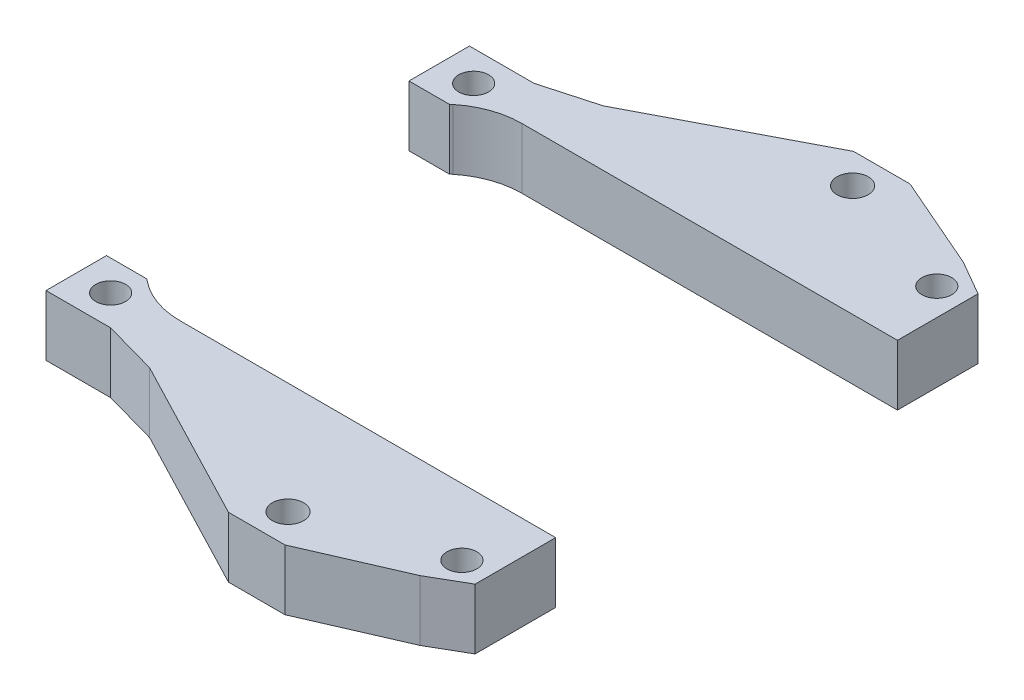
ISO-10303-21;
HEADER;
FILE_DESCRIPTION(('STEP AP214'),'2;1');
FILE_NAME('part.step','',(''),(''),'','','');
FILE_SCHEMA(('AUTOMOTIVE_DESIGN { 1 0 10303 214 1 1 1 1 }'));
ENDSEC;
DATA;
#1=APPLICATION_CONTEXT('core data for automotive mechanical design processes');
#2=APPLICATION_PROTOCOL_DEFINITION('international standard','automotive_design',2000,#1);
#3=PRODUCT_CONTEXT('',#1,'mechanical');
#4=PRODUCT('Part','Part','',(#3));
#5=PRODUCT_RELATED_PRODUCT_CATEGORY('part','',(#4));
#6=PRODUCT_DEFINITION_FORMATION('','',#4);
#7=PRODUCT_DEFINITION_CONTEXT('part definition',#1,'design');
#8=PRODUCT_DEFINITION('design','',#6,#7);
#9=PRODUCT_DEFINITION_SHAPE('','',#8);
#10=(LENGTH_UNIT() NAMED_UNIT(*) SI_UNIT(.MILLI.,.METRE.));
#11=(NAMED_UNIT(*) PLANE_ANGLE_UNIT() SI_UNIT($,.RADIAN.));
#12=(NAMED_UNIT(*) SI_UNIT($,.STERADIAN.) SOLID_ANGLE_UNIT());
#13=UNCERTAINTY_MEASURE_WITH_UNIT(LENGTH_MEASURE(1.E-05),#10,'distance_accuracy_value','');
#14=(GEOMETRIC_REPRESENTATION_CONTEXT(3) GLOBAL_UNCERTAINTY_ASSIGNED_CONTEXT((#13)) GLOBAL_UNIT_ASSIGNED_CONTEXT((#10,
#11,#12)) REPRESENTATION_CONTEXT('',''));
#15=CARTESIAN_POINT('',(0.,0.,0.));
#16=DIRECTION('',(0.,0.,1.));
#17=DIRECTION('',(1.,0.,0.));
#18=AXIS2_PLACEMENT_3D('',#15,#16,#17);
#19=CARTESIAN_POINT('',(40.,6.,-31.));
#20=DIRECTION('',(-1.,0.,0.));
#21=DIRECTION('',(0.,0.,1.));
#22=AXIS2_PLACEMENT_3D('',#19,#20,#21);
#23=PLANE('',#22);
#24=DIRECTION('',(0.,0.,-1.));
#25=VECTOR('',#24,1.);
#26=CARTESIAN_POINT('',(40.,0.,-31.));
#27=LINE('',#26,#25);
#28=CARTESIAN_POINT('',(40.,0.,-16.9499999999827));
#29=VERTEX_POINT('',#28);
#30=CARTESIAN_POINT('',(40.,0.,-24.9378221735089));
#31=VERTEX_POINT('',#30);
#32=EDGE_CURVE('E310',#29,#31,#27,.T.);
#33=ORIENTED_EDGE('',*,*,#32,.T.);
#34=DIRECTION('',(0.,-1.,0.));
#35=VECTOR('',#34,1.);
#36=CARTESIAN_POINT('',(40.,20.,-24.9378221735089));
#37=LINE('',#36,#35);
#38=CARTESIAN_POINT('',(40.,6.,-24.9378221735089));
#39=VERTEX_POINT('',#38);
#40=EDGE_CURVE('E321',#39,#31,#37,.T.);
#41=ORIENTED_EDGE('',*,*,#40,.F.);
#42=DIRECTION('',(0.,0.,-1.));
#43=VECTOR('',#42,1.);
#44=CARTESIAN_POINT('',(40.,6.,-31.));
#45=LINE('',#44,#43);
#46=CARTESIAN_POINT('',(40.,6.,-16.9499999999827));
#47=VERTEX_POINT('',#46);
#48=EDGE_CURVE('E294',#47,#39,#45,.T.);
#49=ORIENTED_EDGE('',*,*,#48,.F.);
#50=DIRECTION('',(0.,-1.,0.));
#51=VECTOR('',#50,1.);
#52=CARTESIAN_POINT('',(40.,20.,-16.9499999999827));
#53=LINE('',#52,#51);
#54=EDGE_CURVE('E307',#47,#29,#53,.T.);
#55=ORIENTED_EDGE('',*,*,#54,.T.);
#56=EDGE_LOOP('',(#33,#41,#49,#55));
#57=FACE_BOUND('',#56,.T.);
#58=ADVANCED_FACE('F175',(#57),#23,.F.);
#59=CARTESIAN_POINT('',(-40.,6.,-31.));
#60=DIRECTION('',(0.,0.,1.));
#61=DIRECTION('',(1.,0.,0.));
#62=AXIS2_PLACEMENT_3D('',#59,#60,#61);
#63=PLANE('',#62);
#64=DIRECTION('',(-1.,0.,0.));
#65=VECTOR('',#64,1.);
#66=CARTESIAN_POINT('',(-40.,0.,-31.));
#67=LINE('',#66,#65);
#68=CARTESIAN_POINT('',(27.1999999999999,0.,-31.));
#69=VERTEX_POINT('',#68);
#70=CARTESIAN_POINT('',(21.5999999999999,0.,-31.));
#71=VERTEX_POINT('',#70);
#72=EDGE_CURVE('E296',#69,#71,#67,.T.);
#73=ORIENTED_EDGE('',*,*,#72,.T.);
#74=DIRECTION('',(0.,1.,0.));
#75=VECTOR('',#74,1.);
#76=CARTESIAN_POINT('',(21.5999999999999,-14.,-31.));
#77=LINE('',#76,#75);
#78=CARTESIAN_POINT('',(21.5999999999999,6.,-31.));
#79=VERTEX_POINT('',#78);
#80=EDGE_CURVE('E286',#71,#79,#77,.T.);
#81=ORIENTED_EDGE('',*,*,#80,.T.);
#82=DIRECTION('',(-1.,0.,0.));
#83=VECTOR('',#82,1.);
#84=CARTESIAN_POINT('',(-40.,6.,-31.));
#85=LINE('',#84,#83);
#86=CARTESIAN_POINT('',(27.1999999999999,6.,-31.));
#87=VERTEX_POINT('',#86);
#88=EDGE_CURVE('E285',#87,#79,#85,.T.);
#89=ORIENTED_EDGE('',*,*,#88,.F.);
#90=DIRECTION('',(0.,1.,0.));
#91=VECTOR('',#90,1.);
#92=CARTESIAN_POINT('',(27.1999999999999,-14.,-31.));
#93=LINE('',#92,#91);
#94=EDGE_CURVE('E287',#69,#87,#93,.T.);
#95=ORIENTED_EDGE('',*,*,#94,.F.);
#96=EDGE_LOOP('',(#73,#81,#89,#95));
#97=FACE_BOUND('',#96,.T.);
#98=ADVANCED_FACE('F393',(#97),#63,.F.);
#99=CARTESIAN_POINT('',(0.,6.,0.));
#100=DIRECTION('',(0.,1.,0.));
#101=DIRECTION('',(0.,0.,1.));
#102=AXIS2_PLACEMENT_3D('',#99,#100,#101);
#103=PLANE('',#102);
#104=DIRECTION('',(0.886942280006643,0.,-0.461880278791613));
#105=VECTOR('',#104,1.);
#106=CARTESIAN_POINT('',(-8.09149430857671,6.,-15.5379840626357));
#107=LINE('',#106,#105);
#108=CARTESIAN_POINT('',(5.27756813566442,6.,-22.5000000000001));
#109=VERTEX_POINT('',#108);
#110=EDGE_CURVE('E265',#109,#79,#107,.T.);
#111=ORIENTED_EDGE('',*,*,#110,.F.);
#112=DIRECTION('',(-0.963031557414725,0.,0.269388602994575));
#113=VECTOR('',#112,1.);
#114=CARTESIAN_POINT('',(-5.45417455493503,6.,-19.4980120081644));
#115=LINE('',#114,#113);
#116=CARTESIAN_POINT('',(-0.0847497948802582,6.,-21.));
#117=VERTEX_POINT('',#116);
#118=EDGE_CURVE('E282',#109,#117,#115,.T.);
#119=ORIENTED_EDGE('',*,*,#118,.T.);
#120=DIRECTION('',(-1.,0.,0.));
#121=VECTOR('',#120,1.);
#122=CARTESIAN_POINT('',(0.,6.,-21.));
#123=LINE('',#122,#121);
#124=CARTESIAN_POINT('',(-6.50000000000002,6.,-21.));
#125=VERTEX_POINT('',#124);
#126=EDGE_CURVE('E292',#117,#125,#123,.T.);
#127=ORIENTED_EDGE('',*,*,#126,.T.);
#128=DIRECTION('',(0.,0.,-1.));
#129=VECTOR('',#128,1.);
#130=CARTESIAN_POINT('',(-6.50000000000002,6.,0.));
#131=LINE('',#130,#129);
#132=CARTESIAN_POINT('',(-6.50000000000002,6.,-15.));
#133=VERTEX_POINT('',#132);
#134=EDGE_CURVE('E369',#133,#125,#131,.T.);
#135=ORIENTED_EDGE('',*,*,#134,.F.);
#136=DIRECTION('',(-1.,0.,0.));
#137=VECTOR('',#136,1.);
#138=CARTESIAN_POINT('',(0.,6.,-15.));
#139=LINE('',#138,#137);
#140=CARTESIAN_POINT('',(-2.50000000000014,6.,-15.));
#141=VERTEX_POINT('',#140);
#142=EDGE_CURVE('E315',#141,#133,#139,.T.);
#143=ORIENTED_EDGE('',*,*,#142,.F.);
#144=DIRECTION('',(-0.778063834888936,0.,0.628185218576434));
#145=VECTOR('',#144,1.);
#146=CARTESIAN_POINT('',(-8.31806467488673,6.,-10.3026704678965));
#147=LINE('',#146,#145);
#148=CARTESIAN_POINT('',(-2.28385284436851,6.,-15.1745106790942));
#149=VERTEX_POINT('',#148);
#150=EDGE_CURVE('E306',#149,#141,#147,.T.);
#151=ORIENTED_EDGE('',*,*,#150,.F.);
#152=CARTESIAN_POINT('',(2.74162890424296,6.,-8.94999999998273));
#153=DIRECTION('',(0.,1.,0.));
#154=DIRECTION('',(0.,0.,1.));
#155=AXIS2_PLACEMENT_3D('',#152,#153,#154);
#156=CIRCLE('',#155,8.);
#157=CARTESIAN_POINT('',(2.74162890424298,6.,-16.9499999999827));
#158=VERTEX_POINT('',#157);
#159=EDGE_CURVE('E13',#149,#158,#156,.F.);
#160=ORIENTED_EDGE('',*,*,#159,.T.);
#161=DIRECTION('',(-1.,0.,0.));
#162=VECTOR('',#161,1.);
#163=CARTESIAN_POINT('',(0.,6.,-16.9499999999827));
#164=LINE('',#163,#162);
#165=EDGE_CURVE('E313',#47,#158,#164,.T.);
#166=ORIENTED_EDGE('',*,*,#165,.F.);
#167=ORIENTED_EDGE('',*,*,#48,.T.);
#168=DIRECTION('',(0.866025403784439,0.,0.5));
#169=VECTOR('',#168,1.);
#170=CARTESIAN_POINT('',(20.7983937586588,6.,-36.0238747058204));
#171=LINE('',#170,#169);
#172=CARTESIAN_POINT('',(36.5358983848623,6.,-26.9378221735089));
#173=VERTEX_POINT('',#172);
#174=EDGE_CURVE('E273',#173,#39,#171,.T.);
#175=ORIENTED_EDGE('',*,*,#174,.F.);
#176=DIRECTION('',(0.916958988129414,0.,0.398981470858839));
#177=VECTOR('',#176,1.);
#178=CARTESIAN_POINT('',(15.6712040430464,6.,-36.0163377290409));
#179=LINE('',#178,#177);
#180=EDGE_CURVE('E567',#87,#173,#179,.T.);
#181=ORIENTED_EDGE('',*,*,#180,.F.);
#182=ORIENTED_EDGE('',*,*,#88,.T.);
#183=EDGE_LOOP('',(#111,#119,#127,#135,#143,#151,#160,#166,#167,#175,#181,#182));
#184=FACE_BOUND('',#183,.T.);
#185=CARTESIAN_POINT('',(37.3,6.,-23.5499999999827));
#186=DIRECTION('',(0.,1.,0.));
#187=DIRECTION('',(0.,0.,1.));
#188=AXIS2_PLACEMENT_3D('',#185,#186,#187);
#189=CIRCLE('',#188,1.48);
#190=CARTESIAN_POINT('',(37.3,6.,-22.0699999999827));
#191=VERTEX_POINT('',#190);
#192=EDGE_CURVE('E376',#191,#191,#189,.T.);
#193=ORIENTED_EDGE('',*,*,#192,.F.);
#194=EDGE_LOOP('',(#193));
#195=FACE_BOUND('',#194,.T.);
#196=CARTESIAN_POINT('',(-3.08474979488025,6.,-18.));
#197=DIRECTION('',(0.,1.,0.));
#198=DIRECTION('',(0.,0.,1.));
#199=AXIS2_PLACEMENT_3D('',#196,#197,#198);
#200=CIRCLE('',#199,1.48);
#201=CARTESIAN_POINT('',(-3.08474979488025,6.,-16.52));
#202=VERTEX_POINT('',#201);
#203=EDGE_CURVE('E372',#202,#202,#200,.T.);
#204=ORIENTED_EDGE('',*,*,#203,.F.);
#205=EDGE_LOOP('',(#204));
#206=FACE_BOUND('',#205,.T.);
#207=CARTESIAN_POINT('',(24.5,6.,-28.));
#208=DIRECTION('',(0.,1.,0.));
#209=DIRECTION('',(0.,0.,1.));
#210=AXIS2_PLACEMENT_3D('',#207,#208,#209);
#211=CIRCLE('',#210,1.55);
#212=CARTESIAN_POINT('',(24.5,6.,-26.45));
#213=VERTEX_POINT('',#212);
#214=EDGE_CURVE('E334',#213,#213,#211,.T.);
#215=ORIENTED_EDGE('',*,*,#214,.F.);
#216=EDGE_LOOP('',(#215));
#217=FACE_BOUND('',#216,.T.);
#218=ADVANCED_FACE('F279',(#184,#195,#206,#217),#103,.T.);
#219=CARTESIAN_POINT('',(0.,0.,0.));
#220=DIRECTION('',(0.,1.,0.));
#221=DIRECTION('',(0.,0.,1.));
#222=AXIS2_PLACEMENT_3D('',#219,#220,#221);
#223=PLANE('',#222);
#224=CARTESIAN_POINT('',(37.3,0.,-23.5499999999827));
#225=DIRECTION('',(0.,-1.,0.));
#226=DIRECTION('',(0.,0.,-1.));
#227=AXIS2_PLACEMENT_3D('',#224,#225,#226);
#228=CIRCLE('',#227,1.48);
#229=CARTESIAN_POINT('',(37.3,0.,-25.0299999999827));
#230=VERTEX_POINT('',#229);
#231=EDGE_CURVE('E373',#230,#230,#228,.T.);
#232=ORIENTED_EDGE('',*,*,#231,.F.);
#233=EDGE_LOOP('',(#232));
#234=FACE_BOUND('',#233,.T.);
#235=CARTESIAN_POINT('',(-3.08474979488025,0.,-18.));
#236=DIRECTION('',(0.,-1.,0.));
#237=DIRECTION('',(0.,0.,-1.));
#238=AXIS2_PLACEMENT_3D('',#235,#236,#237);
#239=CIRCLE('',#238,1.48);
#240=CARTESIAN_POINT('',(-3.08474979488025,0.,-19.48));
#241=VERTEX_POINT('',#240);
#242=EDGE_CURVE('E379',#241,#241,#239,.T.);
#243=ORIENTED_EDGE('',*,*,#242,.F.);
#244=EDGE_LOOP('',(#243));
#245=FACE_BOUND('',#244,.T.);
#246=CARTESIAN_POINT('',(24.5,0.,-28.));
#247=DIRECTION('',(0.,1.,0.));
#248=DIRECTION('',(0.,0.,1.));
#249=AXIS2_PLACEMENT_3D('',#246,#247,#248);
#250=CIRCLE('',#249,1.55);
#251=CARTESIAN_POINT('',(24.5,0.,-26.45));
#252=VERTEX_POINT('',#251);
#253=EDGE_CURVE('E331',#252,#252,#250,.T.);
#254=ORIENTED_EDGE('',*,*,#253,.T.);
#255=EDGE_LOOP('',(#254));
#256=FACE_BOUND('',#255,.T.);
#257=DIRECTION('',(0.963031557414725,0.,-0.269388602994575));
#258=VECTOR('',#257,1.);
#259=CARTESIAN_POINT('',(-5.45417455493503,0.,-19.4980120081644));
#260=LINE('',#259,#258);
#261=CARTESIAN_POINT('',(-0.0847497948802582,0.,-21.));
#262=VERTEX_POINT('',#261);
#263=CARTESIAN_POINT('',(5.27756813566442,0.,-22.5000000000001));
#264=VERTEX_POINT('',#263);
#265=EDGE_CURVE('E319',#262,#264,#260,.T.);
#266=ORIENTED_EDGE('',*,*,#265,.T.);
#267=DIRECTION('',(0.886942280006643,0.,-0.461880278791613));
#268=VECTOR('',#267,1.);
#269=CARTESIAN_POINT('',(-8.09149430857671,0.,-15.5379840626357));
#270=LINE('',#269,#268);
#271=EDGE_CURVE('E268',#264,#71,#270,.T.);
#272=ORIENTED_EDGE('',*,*,#271,.T.);
#273=ORIENTED_EDGE('',*,*,#72,.F.);
#274=DIRECTION('',(0.916958988129414,0.,0.398981470858839));
#275=VECTOR('',#274,1.);
#276=CARTESIAN_POINT('',(15.6712040430464,0.,-36.0163377290409));
#277=LINE('',#276,#275);
#278=CARTESIAN_POINT('',(36.5358983848623,0.,-26.9378221735089));
#279=VERTEX_POINT('',#278);
#280=EDGE_CURVE('E394',#69,#279,#277,.T.);
#281=ORIENTED_EDGE('',*,*,#280,.T.);
#282=DIRECTION('',(-0.866025403784439,0.,-0.5));
#283=VECTOR('',#282,1.);
#284=CARTESIAN_POINT('',(20.7983937586588,0.,-36.0238747058204));
#285=LINE('',#284,#283);
#286=EDGE_CURVE('E323',#31,#279,#285,.T.);
#287=ORIENTED_EDGE('',*,*,#286,.F.);
#288=ORIENTED_EDGE('',*,*,#32,.F.);
#289=DIRECTION('',(1.,0.,0.));
#290=VECTOR('',#289,1.);
#291=CARTESIAN_POINT('',(0.,0.,-16.9499999999827));
#292=LINE('',#291,#290);
#293=CARTESIAN_POINT('',(2.74162890424298,0.,-16.9499999999827));
#294=VERTEX_POINT('',#293);
#295=EDGE_CURVE('E311',#294,#29,#292,.T.);
#296=ORIENTED_EDGE('',*,*,#295,.F.);
#297=CARTESIAN_POINT('',(2.74162890424296,0.,-8.94999999998273));
#298=DIRECTION('',(0.,1.,0.));
#299=DIRECTION('',(0.,0.,1.));
#300=AXIS2_PLACEMENT_3D('',#297,#298,#299);
#301=CIRCLE('',#300,8.);
#302=CARTESIAN_POINT('',(-2.28385284436851,0.,-15.1745106790942));
#303=VERTEX_POINT('',#302);
#304=EDGE_CURVE('E183',#294,#303,#301,.T.);
#305=ORIENTED_EDGE('',*,*,#304,.T.);
#306=DIRECTION('',(0.778063834888936,0.,-0.628185218576434));
#307=VECTOR('',#306,1.);
#308=CARTESIAN_POINT('',(-8.31806467488673,0.,-10.3026704678965));
#309=LINE('',#308,#307);
#310=CARTESIAN_POINT('',(-2.50000000000014,0.,-15.));
#311=VERTEX_POINT('',#310);
#312=EDGE_CURVE('E305',#311,#303,#309,.T.);
#313=ORIENTED_EDGE('',*,*,#312,.F.);
#314=DIRECTION('',(1.,0.,0.));
#315=VECTOR('',#314,1.);
#316=CARTESIAN_POINT('',(0.,0.,-15.));
#317=LINE('',#316,#315);
#318=CARTESIAN_POINT('',(-6.50000000000002,0.,-15.));
#319=VERTEX_POINT('',#318);
#320=EDGE_CURVE('E301',#319,#311,#317,.T.);
#321=ORIENTED_EDGE('',*,*,#320,.F.);
#322=DIRECTION('',(0.,0.,1.));
#323=VECTOR('',#322,1.);
#324=CARTESIAN_POINT('',(-6.50000000000002,0.,-15.));
#325=LINE('',#324,#323);
#326=CARTESIAN_POINT('',(-6.50000000000002,0.,-21.));
#327=VERTEX_POINT('',#326);
#328=EDGE_CURVE('E382',#327,#319,#325,.T.);
#329=ORIENTED_EDGE('',*,*,#328,.F.);
#330=DIRECTION('',(1.,0.,0.));
#331=VECTOR('',#330,1.);
#332=CARTESIAN_POINT('',(0.,0.,-21.));
#333=LINE('',#332,#331);
#334=EDGE_CURVE('E317',#327,#262,#333,.T.);
#335=ORIENTED_EDGE('',*,*,#334,.T.);
#336=EDGE_LOOP('',(#266,#272,#273,#281,#287,#288,#296,#305,#313,#321,#329,#335));
#337=FACE_BOUND('',#336,.T.);
#338=ADVANCED_FACE('F350',(#234,#245,#256,#337),#223,.F.);
#339=CARTESIAN_POINT('',(0.,20.,-16.9499999999827));
#340=DIRECTION('',(0.,0.,-1.));
#341=DIRECTION('',(-1.,0.,0.));
#342=AXIS2_PLACEMENT_3D('',#339,#340,#341);
#343=PLANE('',#342);
#344=ORIENTED_EDGE('',*,*,#165,.T.);
#345=DIRECTION('',(0.,-1.,0.));
#346=VECTOR('',#345,1.);
#347=CARTESIAN_POINT('',(2.74162890424298,0.,-16.9499999999827));
#348=LINE('',#347,#346);
#349=EDGE_CURVE('E339',#158,#294,#348,.T.);
#350=ORIENTED_EDGE('',*,*,#349,.T.);
#351=ORIENTED_EDGE('',*,*,#295,.T.);
#352=ORIENTED_EDGE('',*,*,#54,.F.);
#353=EDGE_LOOP('',(#344,#350,#351,#352));
#354=FACE_BOUND('',#353,.T.);
#355=ADVANCED_FACE('F345',(#354),#343,.F.);
#356=CARTESIAN_POINT('',(-8.31806467488673,20.,-10.3026704678965));
#357=DIRECTION('',(-0.628185218576434,0.,-0.778063834888936));
#358=DIRECTION('',(-0.778063834888936,0.,0.628185218576434));
#359=AXIS2_PLACEMENT_3D('',#356,#357,#358);
#360=PLANE('',#359);
#361=ORIENTED_EDGE('',*,*,#312,.T.);
#362=DIRECTION('',(0.,-1.,0.));
#363=VECTOR('',#362,1.);
#364=CARTESIAN_POINT('',(-2.28385284436851,6.,-15.1745106790942));
#365=LINE('',#364,#363);
#366=EDGE_CURVE('E196',#303,#149,#365,.F.);
#367=ORIENTED_EDGE('',*,*,#366,.T.);
#368=ORIENTED_EDGE('',*,*,#150,.T.);
#369=DIRECTION('',(0.,-1.,0.));
#370=VECTOR('',#369,1.);
#371=CARTESIAN_POINT('',(-2.50000000000014,20.,-15.));
#372=LINE('',#371,#370);
#373=EDGE_CURVE('E302',#141,#311,#372,.T.);
#374=ORIENTED_EDGE('',*,*,#373,.T.);
#375=EDGE_LOOP('',(#361,#367,#368,#374));
#376=FACE_BOUND('',#375,.T.);
#377=ADVANCED_FACE('F416',(#376),#360,.F.);
#378=CARTESIAN_POINT('',(0.,20.,-15.));
#379=DIRECTION('',(0.,0.,-1.));
#380=DIRECTION('',(-1.,0.,0.));
#381=AXIS2_PLACEMENT_3D('',#378,#379,#380);
#382=PLANE('',#381);
#383=ORIENTED_EDGE('',*,*,#142,.T.);
#384=DIRECTION('',(0.,-1.,0.));
#385=VECTOR('',#384,1.);
#386=CARTESIAN_POINT('',(-6.50000000000002,20.,-15.));
#387=LINE('',#386,#385);
#388=EDGE_CURVE('E366',#133,#319,#387,.T.);
#389=ORIENTED_EDGE('',*,*,#388,.T.);
#390=ORIENTED_EDGE('',*,*,#320,.T.);
#391=ORIENTED_EDGE('',*,*,#373,.F.);
#392=EDGE_LOOP('',(#383,#389,#390,#391));
#393=FACE_BOUND('',#392,.T.);
#394=ADVANCED_FACE('F365',(#393),#382,.F.);
#395=CARTESIAN_POINT('',(0.,20.,-21.));
#396=DIRECTION('',(0.,0.,-1.));
#397=DIRECTION('',(-1.,0.,0.));
#398=AXIS2_PLACEMENT_3D('',#395,#396,#397);
#399=PLANE('',#398);
#400=DIRECTION('',(0.,-1.,0.));
#401=VECTOR('',#400,1.);
#402=CARTESIAN_POINT('',(-6.50000000000002,20.,-21.));
#403=LINE('',#402,#401);
#404=EDGE_CURVE('E326',#125,#327,#403,.T.);
#405=ORIENTED_EDGE('',*,*,#404,.F.);
#406=ORIENTED_EDGE('',*,*,#126,.F.);
#407=DIRECTION('',(0.,-1.,0.));
#408=VECTOR('',#407,1.);
#409=CARTESIAN_POINT('',(-0.0847497948802582,20.,-21.));
#410=LINE('',#409,#408);
#411=EDGE_CURVE('E274',#117,#262,#410,.T.);
#412=ORIENTED_EDGE('',*,*,#411,.T.);
#413=ORIENTED_EDGE('',*,*,#334,.F.);
#414=EDGE_LOOP('',(#405,#406,#412,#413));
#415=FACE_BOUND('',#414,.T.);
#416=ADVANCED_FACE('F406',(#415),#399,.T.);
#417=CARTESIAN_POINT('',(-5.45417455493503,20.,-19.4980120081644));
#418=DIRECTION('',(-0.269388602994575,0.,-0.963031557414725));
#419=DIRECTION('',(-0.963031557414725,0.,0.269388602994575));
#420=AXIS2_PLACEMENT_3D('',#417,#418,#419);
#421=PLANE('',#420);
#422=DIRECTION('',(0.,-1.,0.));
#423=VECTOR('',#422,1.);
#424=CARTESIAN_POINT('',(5.27756813566442,20.,-22.5000000000001));
#425=LINE('',#424,#423);
#426=EDGE_CURVE('E262',#109,#264,#425,.T.);
#427=ORIENTED_EDGE('',*,*,#426,.T.);
#428=ORIENTED_EDGE('',*,*,#265,.F.);
#429=ORIENTED_EDGE('',*,*,#411,.F.);
#430=ORIENTED_EDGE('',*,*,#118,.F.);
#431=EDGE_LOOP('',(#427,#428,#429,#430));
#432=FACE_BOUND('',#431,.T.);
#433=ADVANCED_FACE('F290',(#432),#421,.T.);
#434=CARTESIAN_POINT('',(20.7983937586588,20.,-36.0238747058204));
#435=DIRECTION('',(-0.5,0.,0.866025403784439));
#436=DIRECTION('',(0.866025403784439,0.,0.5));
#437=AXIS2_PLACEMENT_3D('',#434,#435,#436);
#438=PLANE('',#437);
#439=ORIENTED_EDGE('',*,*,#286,.T.);
#440=DIRECTION('',(0.,1.,0.));
#441=VECTOR('',#440,1.);
#442=CARTESIAN_POINT('',(36.5358983848622,20.,-26.9378221735089));
#443=LINE('',#442,#441);
#444=EDGE_CURVE('E336',#279,#173,#443,.T.);
#445=ORIENTED_EDGE('',*,*,#444,.T.);
#446=ORIENTED_EDGE('',*,*,#174,.T.);
#447=ORIENTED_EDGE('',*,*,#40,.T.);
#448=EDGE_LOOP('',(#439,#445,#446,#447));
#449=FACE_BOUND('',#448,.T.);
#450=ADVANCED_FACE('F414',(#449),#438,.F.);
#451=CARTESIAN_POINT('',(24.5,-14.,-28.));
#452=DIRECTION('',(0.,1.,0.));
#453=DIRECTION('',(0.,0.,1.));
#454=AXIS2_PLACEMENT_3D('',#451,#452,#453);
#455=CYLINDRICAL_SURFACE('',#454,1.55);
#456=ORIENTED_EDGE('',*,*,#214,.T.);
#457=EDGE_LOOP('',(#456));
#458=FACE_BOUND('',#457,.T.);
#459=ORIENTED_EDGE('',*,*,#253,.F.);
#460=EDGE_LOOP('',(#459));
#461=FACE_BOUND('',#460,.T.);
#462=ADVANCED_FACE('F432',(#458,#461),#455,.F.);
#463=CARTESIAN_POINT('',(-6.50000000000002,20.,-15.));
#464=DIRECTION('',(1.,0.,0.));
#465=DIRECTION('',(0.,0.,-1.));
#466=AXIS2_PLACEMENT_3D('',#463,#464,#465);
#467=PLANE('',#466);
#468=ORIENTED_EDGE('',*,*,#134,.T.);
#469=ORIENTED_EDGE('',*,*,#404,.T.);
#470=ORIENTED_EDGE('',*,*,#328,.T.);
#471=ORIENTED_EDGE('',*,*,#388,.F.);
#472=EDGE_LOOP('',(#468,#469,#470,#471));
#473=FACE_BOUND('',#472,.T.);
#474=ADVANCED_FACE('F403',(#473),#467,.F.);
#475=CARTESIAN_POINT('',(-3.08474979488025,20.,-18.));
#476=DIRECTION('',(0.,-1.,0.));
#477=DIRECTION('',(0.,0.,-1.));
#478=AXIS2_PLACEMENT_3D('',#475,#476,#477);
#479=CYLINDRICAL_SURFACE('',#478,1.48);
#480=ORIENTED_EDGE('',*,*,#203,.T.);
#481=EDGE_LOOP('',(#480));
#482=FACE_BOUND('',#481,.T.);
#483=ORIENTED_EDGE('',*,*,#242,.T.);
#484=EDGE_LOOP('',(#483));
#485=FACE_BOUND('',#484,.T.);
#486=ADVANCED_FACE('F454',(#482,#485),#479,.F.);
#487=CARTESIAN_POINT('',(37.3,20.,-23.5499999999827));
#488=DIRECTION('',(0.,-1.,0.));
#489=DIRECTION('',(0.,0.,-1.));
#490=AXIS2_PLACEMENT_3D('',#487,#488,#489);
#491=CYLINDRICAL_SURFACE('',#490,1.48);
#492=ORIENTED_EDGE('',*,*,#192,.T.);
#493=EDGE_LOOP('',(#492));
#494=FACE_BOUND('',#493,.T.);
#495=ORIENTED_EDGE('',*,*,#231,.T.);
#496=EDGE_LOOP('',(#495));
#497=FACE_BOUND('',#496,.T.);
#498=ADVANCED_FACE('F448',(#494,#497),#491,.F.);
#499=CARTESIAN_POINT('',(15.6712040430464,-14.,-36.0163377290409));
#500=DIRECTION('',(-0.398981470858839,0.,0.916958988129414));
#501=DIRECTION('',(0.916958988129414,0.,0.398981470858839));
#502=AXIS2_PLACEMENT_3D('',#499,#500,#501);
#503=PLANE('',#502);
#504=ORIENTED_EDGE('',*,*,#94,.T.);
#505=ORIENTED_EDGE('',*,*,#180,.T.);
#506=ORIENTED_EDGE('',*,*,#444,.F.);
#507=ORIENTED_EDGE('',*,*,#280,.F.);
#508=EDGE_LOOP('',(#504,#505,#506,#507));
#509=FACE_BOUND('',#508,.T.);
#510=ADVANCED_FACE('F443',(#509),#503,.F.);
#511=CARTESIAN_POINT('',(-8.09149430857671,-14.,-15.5379840626357));
#512=DIRECTION('',(0.461880278791613,0.,0.886942280006643));
#513=DIRECTION('',(0.886942280006643,0.,-0.461880278791613));
#514=AXIS2_PLACEMENT_3D('',#511,#512,#513);
#515=PLANE('',#514);
#516=ORIENTED_EDGE('',*,*,#426,.F.);
#517=ORIENTED_EDGE('',*,*,#110,.T.);
#518=ORIENTED_EDGE('',*,*,#80,.F.);
#519=ORIENTED_EDGE('',*,*,#271,.F.);
#520=EDGE_LOOP('',(#516,#517,#518,#519));
#521=FACE_BOUND('',#520,.T.);
#522=ADVANCED_FACE('F264',(#521),#515,.F.);
#523=CARTESIAN_POINT('',(2.74162890424296,20.,-8.94999999998273));
#524=DIRECTION('',(0.,1.,0.));
#525=DIRECTION('',(0.,0.,1.));
#526=AXIS2_PLACEMENT_3D('',#523,#524,#525);
#527=CYLINDRICAL_SURFACE('',#526,8.);
#528=ORIENTED_EDGE('',*,*,#159,.F.);
#529=ORIENTED_EDGE('',*,*,#366,.F.);
#530=ORIENTED_EDGE('',*,*,#304,.F.);
#531=ORIENTED_EDGE('',*,*,#349,.F.);
#532=EDGE_LOOP('',(#528,#529,#530,#531));
#533=FACE_BOUND('',#532,.T.);
#534=ADVANCED_FACE('F177',(#533),#527,.F.);
#535=CLOSED_SHELL('',(#58,#98,#218,#338,#355,#377,#394,#416,#433,#450,#462,#474,#486,#498,#510,
#522,#534));
#536=MANIFOLD_SOLID_BREP('B2',#535);
#537=CARTESIAN_POINT('',(0.,0.,0.));
#538=DIRECTION('',(0.,1.,0.));
#539=DIRECTION('',(0.,0.,1.));
#540=AXIS2_PLACEMENT_3D('',#537,#538,#539);
#541=PLANE('',#540);
#542=CARTESIAN_POINT('',(37.3,0.,23.5499999999827));
#543=DIRECTION('',(0.,-1.,0.));
#544=DIRECTION('',(0.,0.,-1.));
#545=AXIS2_PLACEMENT_3D('',#542,#543,#544);
#546=CIRCLE('',#545,1.48);
#547=CARTESIAN_POINT('',(37.3,0.,22.0699999999827));
#548=VERTEX_POINT('',#547);
#549=EDGE_CURVE('E916',#548,#548,#546,.T.);
#550=ORIENTED_EDGE('',*,*,#549,.F.);
#551=EDGE_LOOP('',(#550));
#552=FACE_BOUND('',#551,.T.);
#553=CARTESIAN_POINT('',(-3.08474979488026,0.,18.));
#554=DIRECTION('',(0.,-1.,0.));
#555=DIRECTION('',(0.,0.,-1.));
#556=AXIS2_PLACEMENT_3D('',#553,#554,#555);
#557=CIRCLE('',#556,1.48);
#558=CARTESIAN_POINT('',(-3.08474979488026,0.,16.52));
#559=VERTEX_POINT('',#558);
#560=EDGE_CURVE('E917',#559,#559,#557,.T.);
#561=ORIENTED_EDGE('',*,*,#560,.F.);
#562=EDGE_LOOP('',(#561));
#563=FACE_BOUND('',#562,.T.);
#564=CARTESIAN_POINT('',(24.5,0.,28.));
#565=DIRECTION('',(0.,1.,0.));
#566=DIRECTION('',(0.,0.,1.));
#567=AXIS2_PLACEMENT_3D('',#564,#565,#566);
#568=CIRCLE('',#567,1.55);
#569=CARTESIAN_POINT('',(24.5,0.,29.55));
#570=VERTEX_POINT('',#569);
#571=EDGE_CURVE('E931',#570,#570,#568,.T.);
#572=ORIENTED_EDGE('',*,*,#571,.T.);
#573=EDGE_LOOP('',(#572));
#574=FACE_BOUND('',#573,.T.);
#575=DIRECTION('',(0.886942280006643,0.,0.461880278791612));
#576=VECTOR('',#575,1.);
#577=CARTESIAN_POINT('',(-8.0914943085767,0.,15.5379840626357));
#578=LINE('',#577,#576);
#579=CARTESIAN_POINT('',(5.27756813566443,0.,22.5000000000001));
#580=VERTEX_POINT('',#579);
#581=CARTESIAN_POINT('',(21.6,0.,31.));
#582=VERTEX_POINT('',#581);
#583=EDGE_CURVE('E665',#580,#582,#578,.T.);
#584=ORIENTED_EDGE('',*,*,#583,.F.);
#585=DIRECTION('',(0.963031557414725,0.,0.269388602994575));
#586=VECTOR('',#585,1.);
#587=CARTESIAN_POINT('',(-5.45417455493503,0.,19.4980120081644));
#588=LINE('',#587,#586);
#589=CARTESIAN_POINT('',(-0.084749794880247,0.,21.));
#590=VERTEX_POINT('',#589);
#591=EDGE_CURVE('E736',#590,#580,#588,.T.);
#592=ORIENTED_EDGE('',*,*,#591,.F.);
#593=DIRECTION('',(1.,0.,0.));
#594=VECTOR('',#593,1.);
#595=CARTESIAN_POINT('',(0.,0.,21.));
#596=LINE('',#595,#594);
#597=CARTESIAN_POINT('',(-6.50000000000002,0.,21.));
#598=VERTEX_POINT('',#597);
#599=EDGE_CURVE('E729',#598,#590,#596,.T.);
#600=ORIENTED_EDGE('',*,*,#599,.F.);
#601=DIRECTION('',(0.,0.,1.));
#602=VECTOR('',#601,1.);
#603=CARTESIAN_POINT('',(-6.50000000000002,0.,21.));
#604=LINE('',#603,#602);
#605=CARTESIAN_POINT('',(-6.50000000000002,0.,15.));
#606=VERTEX_POINT('',#605);
#607=EDGE_CURVE('E921',#606,#598,#604,.T.);
#608=ORIENTED_EDGE('',*,*,#607,.F.);
#609=DIRECTION('',(1.,0.,0.));
#610=VECTOR('',#609,1.);
#611=CARTESIAN_POINT('',(0.,0.,15.));
#612=LINE('',#611,#610);
#613=CARTESIAN_POINT('',(-2.50000000000014,0.,15.));
#614=VERTEX_POINT('',#613);
#615=EDGE_CURVE('E725',#606,#614,#612,.T.);
#616=ORIENTED_EDGE('',*,*,#615,.T.);
#617=DIRECTION('',(0.778063834888937,0.,0.628185218576433));
#618=VECTOR('',#617,1.);
#619=CARTESIAN_POINT('',(-8.31806467488672,0.,10.3026704678966));
#620=LINE('',#619,#618);
#621=CARTESIAN_POINT('',(-2.28385284436855,0.,15.1745106790942));
#622=VERTEX_POINT('',#621);
#623=EDGE_CURVE('E719',#614,#622,#620,.T.);
#624=ORIENTED_EDGE('',*,*,#623,.T.);
#625=CARTESIAN_POINT('',(2.74162890424292,0.,8.94999999998269));
#626=DIRECTION('',(0.,1.,0.));
#627=DIRECTION('',(0.,0.,1.));
#628=AXIS2_PLACEMENT_3D('',#625,#626,#627);
#629=CIRCLE('',#628,8.);
#630=CARTESIAN_POINT('',(2.74162890424292,0.,16.9499999999827));
#631=VERTEX_POINT('',#630);
#632=EDGE_CURVE('E581',#622,#631,#629,.T.);
#633=ORIENTED_EDGE('',*,*,#632,.T.);
#634=DIRECTION('',(1.,0.,0.));
#635=VECTOR('',#634,1.);
#636=CARTESIAN_POINT('',(0.,0.,16.9499999999827));
#637=LINE('',#636,#635);
#638=CARTESIAN_POINT('',(40.,0.,16.9499999999827));
#639=VERTEX_POINT('',#638);
#640=EDGE_CURVE('E727',#631,#639,#637,.T.);
#641=ORIENTED_EDGE('',*,*,#640,.T.);
#642=DIRECTION('',(0.,0.,-1.));
#643=VECTOR('',#642,1.);
#644=CARTESIAN_POINT('',(40.,0.,-31.));
#645=LINE('',#644,#643);
#646=CARTESIAN_POINT('',(40.,0.,24.9378221735089));
#647=VERTEX_POINT('',#646);
#648=EDGE_CURVE('E695',#647,#639,#645,.T.);
#649=ORIENTED_EDGE('',*,*,#648,.F.);
#650=DIRECTION('',(-0.866025403784439,0.,0.5));
#651=VECTOR('',#650,1.);
#652=CARTESIAN_POINT('',(20.7983937586588,0.,36.0238747058204));
#653=LINE('',#652,#651);
#654=CARTESIAN_POINT('',(36.5358983848622,0.,26.9378221735089));
#655=VERTEX_POINT('',#654);
#656=EDGE_CURVE('E766',#647,#655,#653,.T.);
#657=ORIENTED_EDGE('',*,*,#656,.T.);
#658=DIRECTION('',(0.916958988129413,0.,-0.398981470858839));
#659=VECTOR('',#658,1.);
#660=CARTESIAN_POINT('',(15.6712040430464,0.,36.0163377290409));
#661=LINE('',#660,#659);
#662=CARTESIAN_POINT('',(27.1999999999999,0.,31.));
#663=VERTEX_POINT('',#662);
#664=EDGE_CURVE('E670',#663,#655,#661,.T.);
#665=ORIENTED_EDGE('',*,*,#664,.F.);
#666=DIRECTION('',(1.,0.,0.));
#667=VECTOR('',#666,1.);
#668=CARTESIAN_POINT('',(-40.,0.,31.));
#669=LINE('',#668,#667);
#670=EDGE_CURVE('E691',#582,#663,#669,.T.);
#671=ORIENTED_EDGE('',*,*,#670,.F.);
#672=EDGE_LOOP('',(#584,#592,#600,#608,#616,#624,#633,#641,#649,#657,#665,#671));
#673=FACE_BOUND('',#672,.T.);
#674=ADVANCED_FACE('F573',(#552,#563,#574,#673),#541,.F.);
#675=CARTESIAN_POINT('',(0.,6.,0.));
#676=DIRECTION('',(0.,1.,0.));
#677=DIRECTION('',(0.,0.,1.));
#678=AXIS2_PLACEMENT_3D('',#675,#676,#677);
#679=PLANE('',#678);
#680=CARTESIAN_POINT('',(37.3,6.,23.5499999999827));
#681=DIRECTION('',(0.,1.,0.));
#682=DIRECTION('',(0.,0.,1.));
#683=AXIS2_PLACEMENT_3D('',#680,#681,#682);
#684=CIRCLE('',#683,1.48);
#685=CARTESIAN_POINT('',(37.3,6.,25.0299999999827));
#686=VERTEX_POINT('',#685);
#687=EDGE_CURVE('E703',#686,#686,#684,.T.);
#688=ORIENTED_EDGE('',*,*,#687,.F.);
#689=EDGE_LOOP('',(#688));
#690=FACE_BOUND('',#689,.T.);
#691=CARTESIAN_POINT('',(-3.08474979488026,6.,18.));
#692=DIRECTION('',(0.,1.,0.));
#693=DIRECTION('',(0.,0.,1.));
#694=AXIS2_PLACEMENT_3D('',#691,#692,#693);
#695=CIRCLE('',#694,1.48);
#696=CARTESIAN_POINT('',(-3.08474979488026,6.,19.48));
#697=VERTEX_POINT('',#696);
#698=EDGE_CURVE('E700',#697,#697,#695,.T.);
#699=ORIENTED_EDGE('',*,*,#698,.F.);
#700=EDGE_LOOP('',(#699));
#701=FACE_BOUND('',#700,.T.);
#702=CARTESIAN_POINT('',(24.5,6.,28.));
#703=DIRECTION('',(0.,1.,0.));
#704=DIRECTION('',(0.,0.,1.));
#705=AXIS2_PLACEMENT_3D('',#702,#703,#704);
#706=CIRCLE('',#705,1.55);
#707=CARTESIAN_POINT('',(24.5,6.,29.55));
#708=VERTEX_POINT('',#707);
#709=EDGE_CURVE('E707',#708,#708,#706,.T.);
#710=ORIENTED_EDGE('',*,*,#709,.F.);
#711=EDGE_LOOP('',(#710));
#712=FACE_BOUND('',#711,.T.);
#713=DIRECTION('',(-0.963031557414725,0.,-0.269388602994575));
#714=VECTOR('',#713,1.);
#715=CARTESIAN_POINT('',(-5.45417455493503,6.,19.4980120081644));
#716=LINE('',#715,#714);
#717=CARTESIAN_POINT('',(5.27756813566443,6.,22.5000000000001));
#718=VERTEX_POINT('',#717);
#719=CARTESIAN_POINT('',(-0.084749794880247,6.,21.));
#720=VERTEX_POINT('',#719);
#721=EDGE_CURVE('E679',#718,#720,#716,.T.);
#722=ORIENTED_EDGE('',*,*,#721,.F.);
#723=DIRECTION('',(0.886942280006643,0.,0.461880278791613));
#724=VECTOR('',#723,1.);
#725=CARTESIAN_POINT('',(-8.0914943085767,6.,15.5379840626357));
#726=LINE('',#725,#724);
#727=CARTESIAN_POINT('',(21.6,6.,31.));
#728=VERTEX_POINT('',#727);
#729=EDGE_CURVE('E662',#718,#728,#726,.T.);
#730=ORIENTED_EDGE('',*,*,#729,.T.);
#731=DIRECTION('',(1.,0.,0.));
#732=VECTOR('',#731,1.);
#733=CARTESIAN_POINT('',(-40.,6.,31.));
#734=LINE('',#733,#732);
#735=CARTESIAN_POINT('',(27.1999999999999,6.,31.));
#736=VERTEX_POINT('',#735);
#737=EDGE_CURVE('E677',#728,#736,#734,.T.);
#738=ORIENTED_EDGE('',*,*,#737,.T.);
#739=DIRECTION('',(0.916958988129413,0.,-0.398981470858839));
#740=VECTOR('',#739,1.);
#741=CARTESIAN_POINT('',(15.6712040430464,6.,36.0163377290409));
#742=LINE('',#741,#740);
#743=CARTESIAN_POINT('',(36.5358983848623,6.,26.9378221735089));
#744=VERTEX_POINT('',#743);
#745=EDGE_CURVE('E761',#736,#744,#742,.T.);
#746=ORIENTED_EDGE('',*,*,#745,.T.);
#747=DIRECTION('',(0.866025403784439,0.,-0.5));
#748=VECTOR('',#747,1.);
#749=CARTESIAN_POINT('',(20.7983937586588,6.,36.0238747058204));
#750=LINE('',#749,#748);
#751=CARTESIAN_POINT('',(40.,6.,24.9378221735089));
#752=VERTEX_POINT('',#751);
#753=EDGE_CURVE('E698',#744,#752,#750,.T.);
#754=ORIENTED_EDGE('',*,*,#753,.T.);
#755=DIRECTION('',(0.,0.,-1.));
#756=VECTOR('',#755,1.);
#757=CARTESIAN_POINT('',(40.,6.,-31.));
#758=LINE('',#757,#756);
#759=CARTESIAN_POINT('',(40.,6.,16.9499999999827));
#760=VERTEX_POINT('',#759);
#761=EDGE_CURVE('E685',#752,#760,#758,.T.);
#762=ORIENTED_EDGE('',*,*,#761,.T.);
#763=DIRECTION('',(-1.,0.,0.));
#764=VECTOR('',#763,1.);
#765=CARTESIAN_POINT('',(0.,6.,16.9499999999827));
#766=LINE('',#765,#764);
#767=CARTESIAN_POINT('',(2.74162890424292,6.,16.9499999999827));
#768=VERTEX_POINT('',#767);
#769=EDGE_CURVE('E742',#760,#768,#766,.T.);
#770=ORIENTED_EDGE('',*,*,#769,.T.);
#771=CARTESIAN_POINT('',(2.74162890424292,6.,8.94999999998269));
#772=DIRECTION('',(0.,1.,0.));
#773=DIRECTION('',(0.,0.,1.));
#774=AXIS2_PLACEMENT_3D('',#771,#772,#773);
#775=CIRCLE('',#774,8.);
#776=CARTESIAN_POINT('',(-2.28385284436854,6.,15.1745106790942));
#777=VERTEX_POINT('',#776);
#778=EDGE_CURVE('E173',#768,#777,#775,.F.);
#779=ORIENTED_EDGE('',*,*,#778,.T.);
#780=DIRECTION('',(-0.778063834888937,0.,-0.628185218576433));
#781=VECTOR('',#780,1.);
#782=CARTESIAN_POINT('',(-8.31806467488672,6.,10.3026704678966));
#783=LINE('',#782,#781);
#784=CARTESIAN_POINT('',(-2.50000000000014,6.,15.));
#785=VERTEX_POINT('',#784);
#786=EDGE_CURVE('E720',#777,#785,#783,.T.);
#787=ORIENTED_EDGE('',*,*,#786,.T.);
#788=DIRECTION('',(-1.,0.,0.));
#789=VECTOR('',#788,1.);
#790=CARTESIAN_POINT('',(0.,6.,15.));
#791=LINE('',#790,#789);
#792=CARTESIAN_POINT('',(-6.50000000000002,6.,15.));
#793=VERTEX_POINT('',#792);
#794=EDGE_CURVE('E752',#785,#793,#791,.T.);
#795=ORIENTED_EDGE('',*,*,#794,.T.);
#796=DIRECTION('',(0.,0.,-1.));
#797=VECTOR('',#796,1.);
#798=CARTESIAN_POINT('',(-6.50000000000002,6.,0.));
#799=LINE('',#798,#797);
#800=CARTESIAN_POINT('',(-6.50000000000002,6.,21.));
#801=VERTEX_POINT('',#800);
#802=EDGE_CURVE('E704',#801,#793,#799,.T.);
#803=ORIENTED_EDGE('',*,*,#802,.F.);
#804=DIRECTION('',(-1.,0.,0.));
#805=VECTOR('',#804,1.);
#806=CARTESIAN_POINT('',(0.,6.,21.));
#807=LINE('',#806,#805);
#808=EDGE_CURVE('E755',#720,#801,#807,.T.);
#809=ORIENTED_EDGE('',*,*,#808,.F.);
#810=EDGE_LOOP('',(#722,#730,#738,#746,#754,#762,#770,#779,#787,#795,#803,#809));
#811=FACE_BOUND('',#810,.T.);
#812=ADVANCED_FACE('F675',(#690,#701,#712,#811),#679,.T.);
#813=CARTESIAN_POINT('',(-40.,6.,31.));
#814=DIRECTION('',(0.,0.,-1.));
#815=DIRECTION('',(-1.,0.,0.));
#816=AXIS2_PLACEMENT_3D('',#813,#814,#815);
#817=PLANE('',#816);
#818=DIRECTION('',(0.,1.,0.));
#819=VECTOR('',#818,1.);
#820=CARTESIAN_POINT('',(21.6,-14.,31.));
#821=LINE('',#820,#819);
#822=EDGE_CURVE('E659',#582,#728,#821,.T.);
#823=ORIENTED_EDGE('',*,*,#822,.F.);
#824=ORIENTED_EDGE('',*,*,#670,.T.);
#825=DIRECTION('',(0.,1.,0.));
#826=VECTOR('',#825,1.);
#827=CARTESIAN_POINT('',(27.1999999999999,-14.,31.));
#828=LINE('',#827,#826);
#829=EDGE_CURVE('E680',#663,#736,#828,.T.);
#830=ORIENTED_EDGE('',*,*,#829,.T.);
#831=ORIENTED_EDGE('',*,*,#737,.F.);
#832=EDGE_LOOP('',(#823,#824,#830,#831));
#833=FACE_BOUND('',#832,.T.);
#834=ADVANCED_FACE('F683',(#833),#817,.F.);
#835=CARTESIAN_POINT('',(20.7983937586588,20.,36.0238747058204));
#836=DIRECTION('',(0.5,0.,0.866025403784439));
#837=DIRECTION('',(0.866025403784439,0.,-0.5));
#838=AXIS2_PLACEMENT_3D('',#835,#836,#837);
#839=PLANE('',#838);
#840=ORIENTED_EDGE('',*,*,#753,.F.);
#841=DIRECTION('',(0.,-1.,0.));
#842=VECTOR('',#841,1.);
#843=CARTESIAN_POINT('',(36.5358983848622,20.,26.9378221735089));
#844=LINE('',#843,#842);
#845=EDGE_CURVE('E688',#744,#655,#844,.T.);
#846=ORIENTED_EDGE('',*,*,#845,.T.);
#847=ORIENTED_EDGE('',*,*,#656,.F.);
#848=DIRECTION('',(0.,-1.,0.));
#849=VECTOR('',#848,1.);
#850=CARTESIAN_POINT('',(40.,20.,24.9378221735089));
#851=LINE('',#850,#849);
#852=EDGE_CURVE('E731',#752,#647,#851,.T.);
#853=ORIENTED_EDGE('',*,*,#852,.F.);
#854=EDGE_LOOP('',(#840,#846,#847,#853));
#855=FACE_BOUND('',#854,.T.);
#856=ADVANCED_FACE('F764',(#855),#839,.T.);
#857=CARTESIAN_POINT('',(40.,6.,-31.));
#858=DIRECTION('',(-1.,0.,0.));
#859=DIRECTION('',(0.,0.,1.));
#860=AXIS2_PLACEMENT_3D('',#857,#858,#859);
#861=PLANE('',#860);
#862=ORIENTED_EDGE('',*,*,#852,.T.);
#863=ORIENTED_EDGE('',*,*,#648,.T.);
#864=DIRECTION('',(0.,-1.,0.));
#865=VECTOR('',#864,1.);
#866=CARTESIAN_POINT('',(40.,20.,16.9499999999827));
#867=LINE('',#866,#865);
#868=EDGE_CURVE('E739',#760,#639,#867,.T.);
#869=ORIENTED_EDGE('',*,*,#868,.F.);
#870=ORIENTED_EDGE('',*,*,#761,.F.);
#871=EDGE_LOOP('',(#862,#863,#869,#870));
#872=FACE_BOUND('',#871,.T.);
#873=ADVANCED_FACE('F770',(#872),#861,.F.);
#874=CARTESIAN_POINT('',(0.,20.,16.9499999999827));
#875=DIRECTION('',(0.,0.,-1.));
#876=DIRECTION('',(-1.,0.,0.));
#877=AXIS2_PLACEMENT_3D('',#874,#875,#876);
#878=PLANE('',#877);
#879=ORIENTED_EDGE('',*,*,#640,.F.);
#880=DIRECTION('',(0.,-1.,0.));
#881=VECTOR('',#880,1.);
#882=CARTESIAN_POINT('',(2.74162890424292,6.,16.9499999999827));
#883=LINE('',#882,#881);
#884=EDGE_CURVE('E588',#631,#768,#883,.F.);
#885=ORIENTED_EDGE('',*,*,#884,.T.);
#886=ORIENTED_EDGE('',*,*,#769,.F.);
#887=ORIENTED_EDGE('',*,*,#868,.T.);
#888=EDGE_LOOP('',(#879,#885,#886,#887));
#889=FACE_BOUND('',#888,.T.);
#890=ADVANCED_FACE('F771',(#889),#878,.T.);
#891=CARTESIAN_POINT('',(-8.31806467488672,20.,10.3026704678966));
#892=DIRECTION('',(0.628185218576433,0.,-0.778063834888937));
#893=DIRECTION('',(-0.778063834888937,0.,-0.628185218576433));
#894=AXIS2_PLACEMENT_3D('',#891,#892,#893);
#895=PLANE('',#894);
#896=ORIENTED_EDGE('',*,*,#786,.F.);
#897=DIRECTION('',(0.,-1.,0.));
#898=VECTOR('',#897,1.);
#899=CARTESIAN_POINT('',(-2.28385284436855,0.,15.1745106790942));
#900=LINE('',#899,#898);
#901=EDGE_CURVE('E710',#777,#622,#900,.T.);
#902=ORIENTED_EDGE('',*,*,#901,.T.);
#903=ORIENTED_EDGE('',*,*,#623,.F.);
#904=DIRECTION('',(0.,-1.,0.));
#905=VECTOR('',#904,1.);
#906=CARTESIAN_POINT('',(-2.50000000000014,20.,15.));
#907=LINE('',#906,#905);
#908=EDGE_CURVE('E746',#785,#614,#907,.T.);
#909=ORIENTED_EDGE('',*,*,#908,.F.);
#910=EDGE_LOOP('',(#896,#902,#903,#909));
#911=FACE_BOUND('',#910,.T.);
#912=ADVANCED_FACE('F717',(#911),#895,.T.);
#913=CARTESIAN_POINT('',(0.,20.,15.));
#914=DIRECTION('',(0.,0.,-1.));
#915=DIRECTION('',(-1.,0.,0.));
#916=AXIS2_PLACEMENT_3D('',#913,#914,#915);
#917=PLANE('',#916);
#918=DIRECTION('',(0.,-1.,0.));
#919=VECTOR('',#918,1.);
#920=CARTESIAN_POINT('',(-6.50000000000002,20.,15.));
#921=LINE('',#920,#919);
#922=EDGE_CURVE('E926',#793,#606,#921,.T.);
#923=ORIENTED_EDGE('',*,*,#922,.F.);
#924=ORIENTED_EDGE('',*,*,#794,.F.);
#925=ORIENTED_EDGE('',*,*,#908,.T.);
#926=ORIENTED_EDGE('',*,*,#615,.F.);
#927=EDGE_LOOP('',(#923,#924,#925,#926));
#928=FACE_BOUND('',#927,.T.);
#929=ADVANCED_FACE('F812',(#928),#917,.T.);
#930=CARTESIAN_POINT('',(0.,20.,21.));
#931=DIRECTION('',(0.,0.,-1.));
#932=DIRECTION('',(-1.,0.,0.));
#933=AXIS2_PLACEMENT_3D('',#930,#931,#932);
#934=PLANE('',#933);
#935=ORIENTED_EDGE('',*,*,#808,.T.);
#936=DIRECTION('',(0.,-1.,0.));
#937=VECTOR('',#936,1.);
#938=CARTESIAN_POINT('',(-6.50000000000002,20.,21.));
#939=LINE('',#938,#937);
#940=EDGE_CURVE('E684',#801,#598,#939,.T.);
#941=ORIENTED_EDGE('',*,*,#940,.T.);
#942=ORIENTED_EDGE('',*,*,#599,.T.);
#943=DIRECTION('',(0.,-1.,0.));
#944=VECTOR('',#943,1.);
#945=CARTESIAN_POINT('',(-0.084749794880247,20.,21.));
#946=LINE('',#945,#944);
#947=EDGE_CURVE('E743',#720,#590,#946,.T.);
#948=ORIENTED_EDGE('',*,*,#947,.F.);
#949=EDGE_LOOP('',(#935,#941,#942,#948));
#950=FACE_BOUND('',#949,.T.);
#951=ADVANCED_FACE('F808',(#950),#934,.F.);
#952=CARTESIAN_POINT('',(-5.45417455493503,20.,19.4980120081644));
#953=DIRECTION('',(0.269388602994575,0.,-0.963031557414725));
#954=DIRECTION('',(-0.963031557414725,0.,-0.269388602994575));
#955=AXIS2_PLACEMENT_3D('',#952,#953,#954);
#956=PLANE('',#955);
#957=ORIENTED_EDGE('',*,*,#721,.T.);
#958=ORIENTED_EDGE('',*,*,#947,.T.);
#959=ORIENTED_EDGE('',*,*,#591,.T.);
#960=DIRECTION('',(0.,-1.,0.));
#961=VECTOR('',#960,1.);
#962=CARTESIAN_POINT('',(5.27756813566443,20.,22.5000000000001));
#963=LINE('',#962,#961);
#964=EDGE_CURVE('E740',#718,#580,#963,.T.);
#965=ORIENTED_EDGE('',*,*,#964,.F.);
#966=EDGE_LOOP('',(#957,#958,#959,#965));
#967=FACE_BOUND('',#966,.T.);
#968=ADVANCED_FACE('F806',(#967),#956,.F.);
#969=CARTESIAN_POINT('',(24.5,-14.,28.));
#970=DIRECTION('',(0.,1.,0.));
#971=DIRECTION('',(0.,0.,1.));
#972=AXIS2_PLACEMENT_3D('',#969,#970,#971);
#973=CYLINDRICAL_SURFACE('',#972,1.55);
#974=ORIENTED_EDGE('',*,*,#709,.T.);
#975=EDGE_LOOP('',(#974));
#976=FACE_BOUND('',#975,.T.);
#977=ORIENTED_EDGE('',*,*,#571,.F.);
#978=EDGE_LOOP('',(#977));
#979=FACE_BOUND('',#978,.T.);
#980=ADVANCED_FACE('F804',(#976,#979),#973,.F.);
#981=CARTESIAN_POINT('',(-6.50000000000002,20.,21.));
#982=DIRECTION('',(1.,0.,0.));
#983=DIRECTION('',(0.,0.,-1.));
#984=AXIS2_PLACEMENT_3D('',#981,#982,#983);
#985=PLANE('',#984);
#986=ORIENTED_EDGE('',*,*,#802,.T.);
#987=ORIENTED_EDGE('',*,*,#922,.T.);
#988=ORIENTED_EDGE('',*,*,#607,.T.);
#989=ORIENTED_EDGE('',*,*,#940,.F.);
#990=EDGE_LOOP('',(#986,#987,#988,#989));
#991=FACE_BOUND('',#990,.T.);
#992=ADVANCED_FACE('F878',(#991),#985,.F.);
#993=CARTESIAN_POINT('',(-3.08474979488026,20.,18.));
#994=DIRECTION('',(0.,-1.,0.));
#995=DIRECTION('',(0.,0.,-1.));
#996=AXIS2_PLACEMENT_3D('',#993,#994,#995);
#997=CYLINDRICAL_SURFACE('',#996,1.48);
#998=ORIENTED_EDGE('',*,*,#698,.T.);
#999=EDGE_LOOP('',(#998));
#1000=FACE_BOUND('',#999,.T.);
#1001=ORIENTED_EDGE('',*,*,#560,.T.);
#1002=EDGE_LOOP('',(#1001));
#1003=FACE_BOUND('',#1002,.T.);
#1004=ADVANCED_FACE('F887',(#1000,#1003),#997,.F.);
#1005=CARTESIAN_POINT('',(37.3,20.,23.5499999999827));
#1006=DIRECTION('',(0.,-1.,0.));
#1007=DIRECTION('',(0.,0.,-1.));
#1008=AXIS2_PLACEMENT_3D('',#1005,#1006,#1007);
#1009=CYLINDRICAL_SURFACE('',#1008,1.48);
#1010=ORIENTED_EDGE('',*,*,#687,.T.);
#1011=EDGE_LOOP('',(#1010));
#1012=FACE_BOUND('',#1011,.T.);
#1013=ORIENTED_EDGE('',*,*,#549,.T.);
#1014=EDGE_LOOP('',(#1013));
#1015=FACE_BOUND('',#1014,.T.);
#1016=ADVANCED_FACE('F849',(#1012,#1015),#1009,.F.);
#1017=CARTESIAN_POINT('',(15.6712040430464,-14.,36.0163377290409));
#1018=DIRECTION('',(0.398981470858839,0.,0.916958988129413));
#1019=DIRECTION('',(0.916958988129413,0.,-0.398981470858839));
#1020=AXIS2_PLACEMENT_3D('',#1017,#1018,#1019);
#1021=PLANE('',#1020);
#1022=ORIENTED_EDGE('',*,*,#664,.T.);
#1023=ORIENTED_EDGE('',*,*,#845,.F.);
#1024=ORIENTED_EDGE('',*,*,#745,.F.);
#1025=ORIENTED_EDGE('',*,*,#829,.F.);
#1026=EDGE_LOOP('',(#1022,#1023,#1024,#1025));
#1027=FACE_BOUND('',#1026,.T.);
#1028=ADVANCED_FACE('F777',(#1027),#1021,.T.);
#1029=CARTESIAN_POINT('',(-8.0914943085767,-14.,15.5379840626357));
#1030=DIRECTION('',(-0.461880278791612,0.,0.886942280006643));
#1031=DIRECTION('',(0.886942280006643,0.,0.461880278791612));
#1032=AXIS2_PLACEMENT_3D('',#1029,#1030,#1031);
#1033=PLANE('',#1032);
#1034=ORIENTED_EDGE('',*,*,#583,.T.);
#1035=ORIENTED_EDGE('',*,*,#822,.T.);
#1036=ORIENTED_EDGE('',*,*,#729,.F.);
#1037=ORIENTED_EDGE('',*,*,#964,.T.);
#1038=EDGE_LOOP('',(#1034,#1035,#1036,#1037));
#1039=FACE_BOUND('',#1038,.T.);
#1040=ADVANCED_FACE('F661',(#1039),#1033,.T.);
#1041=CARTESIAN_POINT('',(2.74162890424292,20.,8.94999999998269));
#1042=DIRECTION('',(0.,1.,0.));
#1043=DIRECTION('',(0.,0.,1.));
#1044=AXIS2_PLACEMENT_3D('',#1041,#1042,#1043);
#1045=CYLINDRICAL_SURFACE('',#1044,8.);
#1046=ORIENTED_EDGE('',*,*,#778,.F.);
#1047=ORIENTED_EDGE('',*,*,#884,.F.);
#1048=ORIENTED_EDGE('',*,*,#632,.F.);
#1049=ORIENTED_EDGE('',*,*,#901,.F.);
#1050=EDGE_LOOP('',(#1046,#1047,#1048,#1049));
#1051=FACE_BOUND('',#1050,.T.);
#1052=ADVANCED_FACE('F575',(#1051),#1045,.F.);
#1053=CLOSED_SHELL('',(#674,#812,#834,#856,#873,#890,#912,#929,#951,#968,#980,#992,#1004,#1016,
#1028,#1040,#1052));
#1054=MANIFOLD_SOLID_BREP('B7',#1053);
#1055=ADVANCED_BREP_SHAPE_REPRESENTATION('',(#18,#536,#1054),#14);
#1056=SHAPE_DEFINITION_REPRESENTATION(#9,#1055);
ENDSEC;
END-ISO-10303-21;
